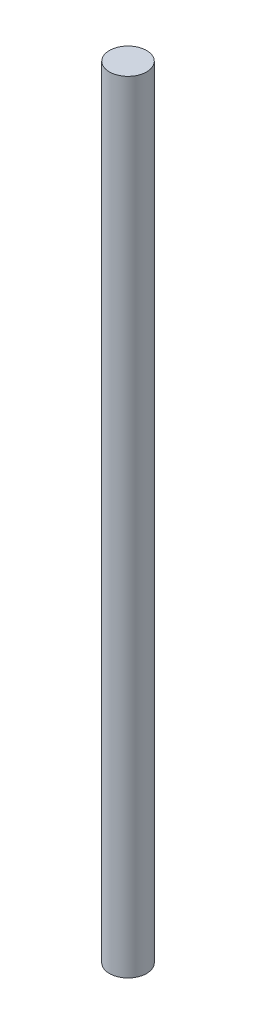
ISO-10303-21;
HEADER;
FILE_DESCRIPTION(('STEP AP214'),'2;1');
FILE_NAME('part.step','',(''),(''),'','','');
FILE_SCHEMA(('AUTOMOTIVE_DESIGN { 1 0 10303 214 1 1 1 1 }'));
ENDSEC;
DATA;
#1=APPLICATION_CONTEXT('core data for automotive mechanical design processes');
#2=APPLICATION_PROTOCOL_DEFINITION('international standard','automotive_design',2000,#1);
#3=PRODUCT_CONTEXT('',#1,'mechanical');
#4=PRODUCT('Part','Part','',(#3));
#5=PRODUCT_RELATED_PRODUCT_CATEGORY('part','',(#4));
#6=PRODUCT_DEFINITION_FORMATION('','',#4);
#7=PRODUCT_DEFINITION_CONTEXT('part definition',#1,'design');
#8=PRODUCT_DEFINITION('design','',#6,#7);
#9=PRODUCT_DEFINITION_SHAPE('','',#8);
#10=(LENGTH_UNIT() NAMED_UNIT(*) SI_UNIT(.MILLI.,.METRE.));
#11=(NAMED_UNIT(*) PLANE_ANGLE_UNIT() SI_UNIT($,.RADIAN.));
#12=(NAMED_UNIT(*) SI_UNIT($,.STERADIAN.) SOLID_ANGLE_UNIT());
#13=UNCERTAINTY_MEASURE_WITH_UNIT(LENGTH_MEASURE(1.E-05),#10,'distance_accuracy_value','');
#14=(GEOMETRIC_REPRESENTATION_CONTEXT(3) GLOBAL_UNCERTAINTY_ASSIGNED_CONTEXT((#13)) GLOBAL_UNIT_ASSIGNED_CONTEXT((#10,
#11,#12)) REPRESENTATION_CONTEXT('',''));
#15=CARTESIAN_POINT('',(0.,0.,0.));
#16=DIRECTION('',(0.,0.,1.));
#17=DIRECTION('',(1.,0.,0.));
#18=AXIS2_PLACEMENT_3D('',#15,#16,#17);
#19=CARTESIAN_POINT('',(-3.37499999139708,50.0000000086049,20.));
#20=DIRECTION('',(0.,-1.,0.));
#21=DIRECTION('',(1.,0.,0.));
#22=AXIS2_PLACEMENT_3D('',#19,#20,#21);
#23=CYLINDRICAL_SURFACE('',#22,5.);
#24=CARTESIAN_POINT('',(-3.37499999139708,50.0000000086049,20.));
#25=DIRECTION('',(0.,-1.,0.));
#26=DIRECTION('',(1.,0.,0.));
#27=AXIS2_PLACEMENT_3D('',#24,#25,#26);
#28=CIRCLE('',#27,5.);
#29=CARTESIAN_POINT('',(1.62500000860293,50.0000000086049,20.));
#30=VERTEX_POINT('',#29);
#31=EDGE_CURVE('E10',#30,#30,#28,.T.);
#32=ORIENTED_EDGE('',*,*,#31,.T.);
#33=EDGE_LOOP('',(#32));
#34=FACE_BOUND('',#33,.T.);
#35=CARTESIAN_POINT('',(-3.37499999139711,-159.999999991395,20.));
#36=DIRECTION('',(0.,-1.,0.));
#37=DIRECTION('',(1.,0.,0.));
#38=AXIS2_PLACEMENT_3D('',#35,#36,#37);
#39=CIRCLE('',#38,5.);
#40=CARTESIAN_POINT('',(1.6250000086029,-159.999999991395,20.));
#41=VERTEX_POINT('',#40);
#42=EDGE_CURVE('E41',#41,#41,#39,.T.);
#43=ORIENTED_EDGE('',*,*,#42,.F.);
#44=EDGE_LOOP('',(#43));
#45=FACE_BOUND('',#44,.T.);
#46=ADVANCED_FACE('F34',(#34,#45),#23,.T.);
#47=CARTESIAN_POINT('',(-3.37499999139708,50.0000000086049,20.));
#48=DIRECTION('',(0.,-1.,0.));
#49=DIRECTION('',(1.,0.,0.));
#50=AXIS2_PLACEMENT_3D('',#47,#48,#49);
#51=PLANE('',#50);
#52=ORIENTED_EDGE('',*,*,#31,.F.);
#53=EDGE_LOOP('',(#52));
#54=FACE_BOUND('',#53,.T.);
#55=ADVANCED_FACE('F51',(#54),#51,.F.);
#56=CARTESIAN_POINT('',(-3.37499999139711,-159.999999991395,20.));
#57=DIRECTION('',(0.,-1.,0.));
#58=DIRECTION('',(1.,0.,0.));
#59=AXIS2_PLACEMENT_3D('',#56,#57,#58);
#60=PLANE('',#59);
#61=ORIENTED_EDGE('',*,*,#42,.T.);
#62=EDGE_LOOP('',(#61));
#63=FACE_BOUND('',#62,.T.);
#64=ADVANCED_FACE('F48',(#63),#60,.T.);
#65=CLOSED_SHELL('',(#46,#55,#64));
#66=MANIFOLD_SOLID_BREP('B2',#65);
#67=ADVANCED_BREP_SHAPE_REPRESENTATION('',(#18,#66),#14);
#68=SHAPE_DEFINITION_REPRESENTATION(#9,#67);
ENDSEC;
END-ISO-10303-21;
